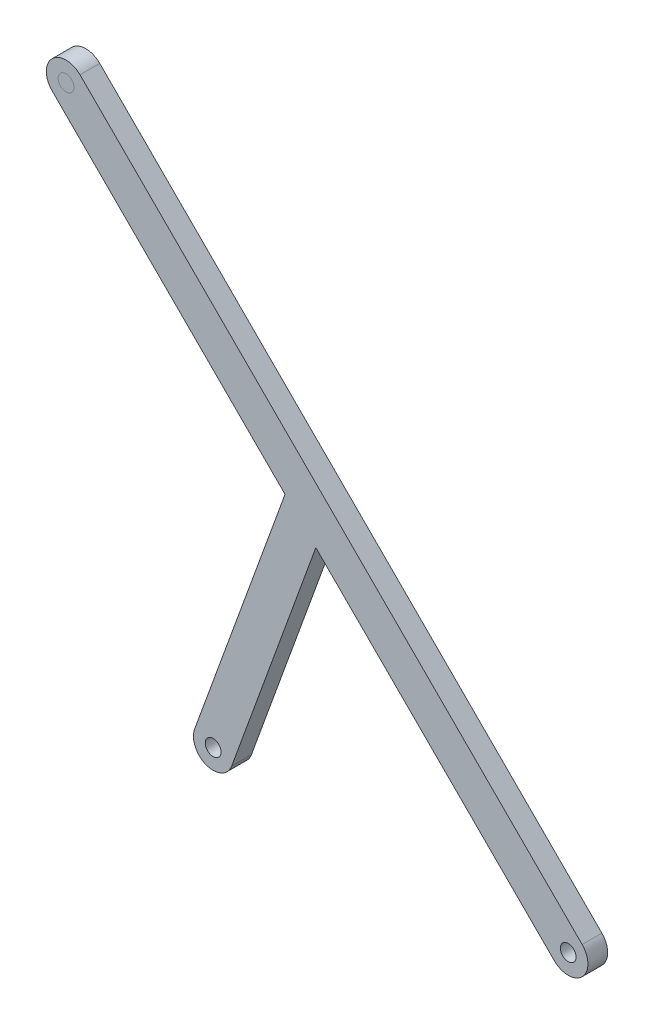
ISO-10303-21;
HEADER;
FILE_DESCRIPTION(('STEP AP214'),'2;1');
FILE_NAME('part.step','',(''),(''),'','','');
FILE_SCHEMA(('AUTOMOTIVE_DESIGN { 1 0 10303 214 1 1 1 1 }'));
ENDSEC;
DATA;
#1=APPLICATION_CONTEXT('core data for automotive mechanical design processes');
#2=APPLICATION_PROTOCOL_DEFINITION('international standard','automotive_design',2000,#1);
#3=PRODUCT_CONTEXT('',#1,'mechanical');
#4=PRODUCT('Part','Part','',(#3));
#5=PRODUCT_RELATED_PRODUCT_CATEGORY('part','',(#4));
#6=PRODUCT_DEFINITION_FORMATION('','',#4);
#7=PRODUCT_DEFINITION_CONTEXT('part definition',#1,'design');
#8=PRODUCT_DEFINITION('design','',#6,#7);
#9=PRODUCT_DEFINITION_SHAPE('','',#8);
#10=(LENGTH_UNIT() NAMED_UNIT(*) SI_UNIT(.MILLI.,.METRE.));
#11=(NAMED_UNIT(*) PLANE_ANGLE_UNIT() SI_UNIT($,.RADIAN.));
#12=(NAMED_UNIT(*) SI_UNIT($,.STERADIAN.) SOLID_ANGLE_UNIT());
#13=UNCERTAINTY_MEASURE_WITH_UNIT(LENGTH_MEASURE(1.E-05),#10,'distance_accuracy_value','');
#14=(GEOMETRIC_REPRESENTATION_CONTEXT(3) GLOBAL_UNCERTAINTY_ASSIGNED_CONTEXT((#13)) GLOBAL_UNIT_ASSIGNED_CONTEXT((#10,
#11,#12)) REPRESENTATION_CONTEXT('',''));
#15=CARTESIAN_POINT('',(0.,0.,0.));
#16=DIRECTION('',(0.,0.,1.));
#17=DIRECTION('',(1.,0.,0.));
#18=AXIS2_PLACEMENT_3D('',#15,#16,#17);
#19=CARTESIAN_POINT('',(0.,0.,10.));
#20=DIRECTION('',(0.,0.,1.));
#21=DIRECTION('',(1.,0.,0.));
#22=AXIS2_PLACEMENT_3D('',#19,#20,#21);
#23=PLANE('',#22);
#24=CARTESIAN_POINT('',(0.,0.,10.));
#25=DIRECTION('',(0.,0.,1.));
#26=DIRECTION('',(1.,0.,0.));
#27=AXIS2_PLACEMENT_3D('',#24,#25,#26);
#28=CIRCLE('',#27,10.);
#29=CARTESIAN_POINT('',(-7.07106781186557,-7.07106781186557,10.));
#30=VERTEX_POINT('',#29);
#31=CARTESIAN_POINT('',(7.07106781186539,7.07106781186538,10.));
#32=VERTEX_POINT('',#31);
#33=EDGE_CURVE('E153',#30,#32,#28,.T.);
#34=ORIENTED_EDGE('',*,*,#33,.T.);
#35=DIRECTION('',(-0.707106781186547,0.707106781186548,0.));
#36=VECTOR('',#35,1.);
#37=CARTESIAN_POINT('',(7.07106781186539,7.07106781186538,10.));
#38=LINE('',#37,#36);
#39=CARTESIAN_POINT('',(-247.487373415291,261.629509039023,10.));
#40=VERTEX_POINT('',#39);
#41=EDGE_CURVE('E101',#32,#40,#38,.T.);
#42=ORIENTED_EDGE('',*,*,#41,.T.);
#43=CARTESIAN_POINT('',(-254.558441227157,254.558441227157,10.));
#44=DIRECTION('',(0.,0.,1.));
#45=DIRECTION('',(1.,0.,0.));
#46=AXIS2_PLACEMENT_3D('',#43,#44,#45);
#47=CIRCLE('',#46,9.99999999999998);
#48=CARTESIAN_POINT('',(-261.629509039023,247.487373415292,10.));
#49=VERTEX_POINT('',#48);
#50=EDGE_CURVE('E184',#40,#49,#47,.T.);
#51=ORIENTED_EDGE('',*,*,#50,.T.);
#52=DIRECTION('',(0.707106781186547,-0.707106781186548,0.));
#53=VECTOR('',#52,1.);
#54=CARTESIAN_POINT('',(-143.543524060909,129.401388437177,10.));
#55=LINE('',#54,#53);
#56=CARTESIAN_POINT('',(-143.543524060909,129.401388437177,10.));
#57=VERTEX_POINT('',#56);
#58=EDGE_CURVE('E183',#49,#57,#55,.T.);
#59=ORIENTED_EDGE('',*,*,#58,.T.);
#60=DIRECTION('',(-0.342020143325664,-0.93969262078591,0.));
#61=VECTOR('',#60,1.);
#62=CARTESIAN_POINT('',(-143.543524060909,129.401388437177,10.));
#63=LINE('',#62,#61);
#64=CARTESIAN_POINT('',(-189.396926207859,3.42020143325663,10.));
#65=VERTEX_POINT('',#64);
#66=EDGE_CURVE('E120',#57,#65,#63,.T.);
#67=ORIENTED_EDGE('',*,*,#66,.T.);
#68=CARTESIAN_POINT('',(-180.,0.,10.));
#69=DIRECTION('',(0.,0.,1.));
#70=DIRECTION('',(-1.,0.,0.));
#71=AXIS2_PLACEMENT_3D('',#68,#69,#70);
#72=CIRCLE('',#71,10.);
#73=CARTESIAN_POINT('',(-170.603073792141,-3.42020143325665,10.));
#74=VERTEX_POINT('',#73);
#75=EDGE_CURVE('E114',#65,#74,#72,.T.);
#76=ORIENTED_EDGE('',*,*,#75,.T.);
#77=DIRECTION('',(0.342020143325665,0.93969262078591,0.));
#78=VECTOR('',#77,1.);
#79=CARTESIAN_POINT('',(-127.939403886711,113.79726826298,10.));
#80=LINE('',#79,#78);
#81=CARTESIAN_POINT('',(-127.939403886711,113.79726826298,10.));
#82=VERTEX_POINT('',#81);
#83=EDGE_CURVE('E118',#74,#82,#80,.T.);
#84=ORIENTED_EDGE('',*,*,#83,.T.);
#85=DIRECTION('',(0.707106781186547,-0.707106781186548,0.));
#86=VECTOR('',#85,1.);
#87=CARTESIAN_POINT('',(-7.07106781186557,-7.07106781186557,10.));
#88=LINE('',#87,#86);
#89=EDGE_CURVE('E57',#82,#30,#88,.T.);
#90=ORIENTED_EDGE('',*,*,#89,.T.);
#91=EDGE_LOOP('',(#34,#42,#51,#59,#67,#76,#84,#90));
#92=FACE_BOUND('',#91,.T.);
#93=CARTESIAN_POINT('',(0.,0.,10.));
#94=DIRECTION('',(0.,0.,1.));
#95=DIRECTION('',(1.,0.,0.));
#96=AXIS2_PLACEMENT_3D('',#93,#94,#95);
#97=CIRCLE('',#96,4.);
#98=CARTESIAN_POINT('',(3.99999999999999,0.,10.));
#99=VERTEX_POINT('',#98);
#100=EDGE_CURVE('E192',#99,#99,#97,.T.);
#101=ORIENTED_EDGE('',*,*,#100,.F.);
#102=EDGE_LOOP('',(#101));
#103=FACE_BOUND('',#102,.T.);
#104=CARTESIAN_POINT('',(-180.,0.,10.));
#105=DIRECTION('',(0.,0.,1.));
#106=DIRECTION('',(1.,0.,0.));
#107=AXIS2_PLACEMENT_3D('',#104,#105,#106);
#108=CIRCLE('',#107,3.99999999999992);
#109=CARTESIAN_POINT('',(-176.,0.,10.));
#110=VERTEX_POINT('',#109);
#111=EDGE_CURVE('E198',#110,#110,#108,.T.);
#112=ORIENTED_EDGE('',*,*,#111,.F.);
#113=EDGE_LOOP('',(#112));
#114=FACE_BOUND('',#113,.T.);
#115=CARTESIAN_POINT('',(-254.558441227157,254.558441227157,10.));
#116=DIRECTION('',(0.,0.,1.));
#117=DIRECTION('',(1.,0.,0.));
#118=AXIS2_PLACEMENT_3D('',#115,#116,#117);
#119=CIRCLE('',#118,3.99999999999999);
#120=CARTESIAN_POINT('',(-250.558441227157,254.558441227157,10.));
#121=VERTEX_POINT('',#120);
#122=EDGE_CURVE('E11',#121,#121,#119,.F.);
#123=ORIENTED_EDGE('',*,*,#122,.T.);
#124=EDGE_LOOP('',(#123));
#125=FACE_BOUND('',#124,.T.);
#126=ADVANCED_FACE('F39',(#92,#103,#114,#125),#23,.T.);
#127=CARTESIAN_POINT('',(0.,0.,10.));
#128=DIRECTION('',(0.,0.,-1.));
#129=DIRECTION('',(-1.,0.,0.));
#130=AXIS2_PLACEMENT_3D('',#127,#128,#129);
#131=CYLINDRICAL_SURFACE('',#130,10.);
#132=CARTESIAN_POINT('',(0.,0.,0.));
#133=DIRECTION('',(0.,0.,1.));
#134=DIRECTION('',(1.,0.,0.));
#135=AXIS2_PLACEMENT_3D('',#132,#133,#134);
#136=CIRCLE('',#135,10.);
#137=CARTESIAN_POINT('',(-7.07106781186557,-7.07106781186557,0.));
#138=VERTEX_POINT('',#137);
#139=CARTESIAN_POINT('',(7.07106781186539,7.07106781186538,0.));
#140=VERTEX_POINT('',#139);
#141=EDGE_CURVE('E138',#138,#140,#136,.T.);
#142=ORIENTED_EDGE('',*,*,#141,.T.);
#143=DIRECTION('',(0.,0.,-1.));
#144=VECTOR('',#143,1.);
#145=CARTESIAN_POINT('',(7.07106781186539,7.07106781186538,10.));
#146=LINE('',#145,#144);
#147=EDGE_CURVE('E49',#32,#140,#146,.T.);
#148=ORIENTED_EDGE('',*,*,#147,.F.);
#149=ORIENTED_EDGE('',*,*,#33,.F.);
#150=DIRECTION('',(0.,0.,-1.));
#151=VECTOR('',#150,1.);
#152=CARTESIAN_POINT('',(-7.07106781186557,-7.07106781186557,10.));
#153=LINE('',#152,#151);
#154=EDGE_CURVE('E134',#30,#138,#153,.T.);
#155=ORIENTED_EDGE('',*,*,#154,.T.);
#156=EDGE_LOOP('',(#142,#148,#149,#155));
#157=FACE_BOUND('',#156,.T.);
#158=ADVANCED_FACE('F41',(#157),#131,.T.);
#159=CARTESIAN_POINT('',(7.07106781186539,7.07106781186538,10.));
#160=DIRECTION('',(-0.707106781186548,-0.707106781186547,0.));
#161=DIRECTION('',(0.707106781186547,-0.707106781186548,0.));
#162=AXIS2_PLACEMENT_3D('',#159,#160,#161);
#163=PLANE('',#162);
#164=DIRECTION('',(-0.707106781186547,0.707106781186548,0.));
#165=VECTOR('',#164,1.);
#166=CARTESIAN_POINT('',(7.07106781186539,7.07106781186538,0.));
#167=LINE('',#166,#165);
#168=CARTESIAN_POINT('',(-247.487373415291,261.629509039023,0.));
#169=VERTEX_POINT('',#168);
#170=EDGE_CURVE('E141',#140,#169,#167,.T.);
#171=ORIENTED_EDGE('',*,*,#170,.T.);
#172=DIRECTION('',(0.,0.,-1.));
#173=VECTOR('',#172,1.);
#174=CARTESIAN_POINT('',(-247.487373415291,261.629509039023,10.));
#175=LINE('',#174,#173);
#176=EDGE_CURVE('E163',#40,#169,#175,.T.);
#177=ORIENTED_EDGE('',*,*,#176,.F.);
#178=ORIENTED_EDGE('',*,*,#41,.F.);
#179=ORIENTED_EDGE('',*,*,#147,.T.);
#180=EDGE_LOOP('',(#171,#177,#178,#179));
#181=FACE_BOUND('',#180,.T.);
#182=ADVANCED_FACE('F166',(#181),#163,.F.);
#183=CARTESIAN_POINT('',(-254.558441227157,254.558441227157,10.));
#184=DIRECTION('',(0.,0.,-1.));
#185=DIRECTION('',(-1.,0.,0.));
#186=AXIS2_PLACEMENT_3D('',#183,#184,#185);
#187=CYLINDRICAL_SURFACE('',#186,9.99999999999998);
#188=CARTESIAN_POINT('',(-254.558441227157,254.558441227157,0.));
#189=DIRECTION('',(0.,0.,1.));
#190=DIRECTION('',(1.,0.,0.));
#191=AXIS2_PLACEMENT_3D('',#188,#189,#190);
#192=CIRCLE('',#191,9.99999999999998);
#193=CARTESIAN_POINT('',(-261.629509039023,247.487373415292,0.));
#194=VERTEX_POINT('',#193);
#195=EDGE_CURVE('E144',#169,#194,#192,.T.);
#196=ORIENTED_EDGE('',*,*,#195,.T.);
#197=DIRECTION('',(0.,0.,-1.));
#198=VECTOR('',#197,1.);
#199=CARTESIAN_POINT('',(-261.629509039023,247.487373415292,10.));
#200=LINE('',#199,#198);
#201=EDGE_CURVE('E160',#49,#194,#200,.T.);
#202=ORIENTED_EDGE('',*,*,#201,.F.);
#203=ORIENTED_EDGE('',*,*,#50,.F.);
#204=ORIENTED_EDGE('',*,*,#176,.T.);
#205=EDGE_LOOP('',(#196,#202,#203,#204));
#206=FACE_BOUND('',#205,.T.);
#207=ADVANCED_FACE('F177',(#206),#187,.T.);
#208=CARTESIAN_POINT('',(-143.543524060909,129.401388437177,10.));
#209=DIRECTION('',(0.707106781186548,0.707106781186547,0.));
#210=DIRECTION('',(-0.707106781186547,0.707106781186548,0.));
#211=AXIS2_PLACEMENT_3D('',#208,#209,#210);
#212=PLANE('',#211);
#213=DIRECTION('',(0.707106781186547,-0.707106781186548,0.));
#214=VECTOR('',#213,1.);
#215=CARTESIAN_POINT('',(-143.543524060909,129.401388437177,0.));
#216=LINE('',#215,#214);
#217=CARTESIAN_POINT('',(-143.543524060909,129.401388437177,0.));
#218=VERTEX_POINT('',#217);
#219=EDGE_CURVE('E146',#194,#218,#216,.T.);
#220=ORIENTED_EDGE('',*,*,#219,.T.);
#221=DIRECTION('',(0.,0.,-1.));
#222=VECTOR('',#221,1.);
#223=CARTESIAN_POINT('',(-143.543524060909,129.401388437177,10.));
#224=LINE('',#223,#222);
#225=EDGE_CURVE('E157',#57,#218,#224,.T.);
#226=ORIENTED_EDGE('',*,*,#225,.F.);
#227=ORIENTED_EDGE('',*,*,#58,.F.);
#228=ORIENTED_EDGE('',*,*,#201,.T.);
#229=EDGE_LOOP('',(#220,#226,#227,#228));
#230=FACE_BOUND('',#229,.T.);
#231=ADVANCED_FACE('F181',(#230),#212,.F.);
#232=CARTESIAN_POINT('',(-143.543524060909,129.401388437177,10.));
#233=DIRECTION('',(0.93969262078591,-0.342020143325664,0.));
#234=DIRECTION('',(0.342020143325664,0.93969262078591,0.));
#235=AXIS2_PLACEMENT_3D('',#232,#233,#234);
#236=PLANE('',#235);
#237=DIRECTION('',(-0.342020143325664,-0.93969262078591,0.));
#238=VECTOR('',#237,1.);
#239=CARTESIAN_POINT('',(-143.543524060909,129.401388437177,0.));
#240=LINE('',#239,#238);
#241=CARTESIAN_POINT('',(-189.396926207859,3.42020143325663,0.));
#242=VERTEX_POINT('',#241);
#243=EDGE_CURVE('E148',#218,#242,#240,.T.);
#244=ORIENTED_EDGE('',*,*,#243,.T.);
#245=DIRECTION('',(0.,0.,-1.));
#246=VECTOR('',#245,1.);
#247=CARTESIAN_POINT('',(-189.396926207859,3.42020143325663,10.));
#248=LINE('',#247,#246);
#249=EDGE_CURVE('E129',#65,#242,#248,.T.);
#250=ORIENTED_EDGE('',*,*,#249,.F.);
#251=ORIENTED_EDGE('',*,*,#66,.F.);
#252=ORIENTED_EDGE('',*,*,#225,.T.);
#253=EDGE_LOOP('',(#244,#250,#251,#252));
#254=FACE_BOUND('',#253,.T.);
#255=ADVANCED_FACE('F227',(#254),#236,.F.);
#256=CARTESIAN_POINT('',(-180.,0.,10.));
#257=DIRECTION('',(0.,0.,-1.));
#258=DIRECTION('',(-1.,0.,0.));
#259=AXIS2_PLACEMENT_3D('',#256,#257,#258);
#260=CYLINDRICAL_SURFACE('',#259,10.);
#261=CARTESIAN_POINT('',(-180.,0.,0.));
#262=DIRECTION('',(0.,0.,1.));
#263=DIRECTION('',(-1.,0.,0.));
#264=AXIS2_PLACEMENT_3D('',#261,#262,#263);
#265=CIRCLE('',#264,10.);
#266=CARTESIAN_POINT('',(-170.603073792141,-3.42020143325665,0.));
#267=VERTEX_POINT('',#266);
#268=EDGE_CURVE('E128',#242,#267,#265,.T.);
#269=ORIENTED_EDGE('',*,*,#268,.T.);
#270=DIRECTION('',(0.,0.,-1.));
#271=VECTOR('',#270,1.);
#272=CARTESIAN_POINT('',(-170.603073792141,-3.42020143325665,10.));
#273=LINE('',#272,#271);
#274=EDGE_CURVE('E125',#74,#267,#273,.T.);
#275=ORIENTED_EDGE('',*,*,#274,.F.);
#276=ORIENTED_EDGE('',*,*,#75,.F.);
#277=ORIENTED_EDGE('',*,*,#249,.T.);
#278=EDGE_LOOP('',(#269,#275,#276,#277));
#279=FACE_BOUND('',#278,.T.);
#280=ADVANCED_FACE('F126',(#279),#260,.T.);
#281=CARTESIAN_POINT('',(-127.939403886711,113.79726826298,10.));
#282=DIRECTION('',(-0.93969262078591,0.342020143325665,0.));
#283=DIRECTION('',(-0.342020143325665,-0.93969262078591,0.));
#284=AXIS2_PLACEMENT_3D('',#281,#282,#283);
#285=PLANE('',#284);
#286=DIRECTION('',(0.342020143325665,0.93969262078591,0.));
#287=VECTOR('',#286,1.);
#288=CARTESIAN_POINT('',(-127.939403886711,113.79726826298,0.));
#289=LINE('',#288,#287);
#290=CARTESIAN_POINT('',(-127.939403886711,113.79726826298,0.));
#291=VERTEX_POINT('',#290);
#292=EDGE_CURVE('E86',#267,#291,#289,.T.);
#293=ORIENTED_EDGE('',*,*,#292,.T.);
#294=DIRECTION('',(0.,0.,-1.));
#295=VECTOR('',#294,1.);
#296=CARTESIAN_POINT('',(-127.939403886711,113.79726826298,10.));
#297=LINE('',#296,#295);
#298=EDGE_CURVE('E130',#82,#291,#297,.T.);
#299=ORIENTED_EDGE('',*,*,#298,.F.);
#300=ORIENTED_EDGE('',*,*,#83,.F.);
#301=ORIENTED_EDGE('',*,*,#274,.T.);
#302=EDGE_LOOP('',(#293,#299,#300,#301));
#303=FACE_BOUND('',#302,.T.);
#304=ADVANCED_FACE('F132',(#303),#285,.F.);
#305=CARTESIAN_POINT('',(-7.07106781186557,-7.07106781186557,10.));
#306=DIRECTION('',(0.707106781186548,0.707106781186547,0.));
#307=DIRECTION('',(-0.707106781186547,0.707106781186548,0.));
#308=AXIS2_PLACEMENT_3D('',#305,#306,#307);
#309=PLANE('',#308);
#310=DIRECTION('',(0.707106781186547,-0.707106781186548,0.));
#311=VECTOR('',#310,1.);
#312=CARTESIAN_POINT('',(-7.07106781186557,-7.07106781186557,0.));
#313=LINE('',#312,#311);
#314=EDGE_CURVE('E92',#291,#138,#313,.T.);
#315=ORIENTED_EDGE('',*,*,#314,.T.);
#316=ORIENTED_EDGE('',*,*,#154,.F.);
#317=ORIENTED_EDGE('',*,*,#89,.F.);
#318=ORIENTED_EDGE('',*,*,#298,.T.);
#319=EDGE_LOOP('',(#315,#316,#317,#318));
#320=FACE_BOUND('',#319,.T.);
#321=ADVANCED_FACE('F211',(#320),#309,.F.);
#322=ORIENTED_EDGE('',*,*,#122,.F.);
#323=EDGE_LOOP('',(#322));
#324=FACE_BOUND('',#323,.T.);
#325=ADVANCED_FACE('F207',(#324),#23,.T.);
#326=CARTESIAN_POINT('',(0.,0.,0.));
#327=DIRECTION('',(0.,0.,1.));
#328=DIRECTION('',(1.,0.,0.));
#329=AXIS2_PLACEMENT_3D('',#326,#327,#328);
#330=PLANE('',#329);
#331=CARTESIAN_POINT('',(-180.,0.,0.));
#332=DIRECTION('',(0.,0.,1.));
#333=DIRECTION('',(1.,0.,0.));
#334=AXIS2_PLACEMENT_3D('',#331,#332,#333);
#335=CIRCLE('',#334,3.99999999999992);
#336=CARTESIAN_POINT('',(-176.,0.,0.));
#337=VERTEX_POINT('',#336);
#338=EDGE_CURVE('E195',#337,#337,#335,.F.);
#339=ORIENTED_EDGE('',*,*,#338,.F.);
#340=EDGE_LOOP('',(#339));
#341=FACE_BOUND('',#340,.T.);
#342=CARTESIAN_POINT('',(0.,0.,0.));
#343=DIRECTION('',(0.,0.,1.));
#344=DIRECTION('',(1.,0.,0.));
#345=AXIS2_PLACEMENT_3D('',#342,#343,#344);
#346=CIRCLE('',#345,4.);
#347=CARTESIAN_POINT('',(3.99999999999999,0.,0.));
#348=VERTEX_POINT('',#347);
#349=EDGE_CURVE('E142',#348,#348,#346,.F.);
#350=ORIENTED_EDGE('',*,*,#349,.F.);
#351=EDGE_LOOP('',(#350));
#352=FACE_BOUND('',#351,.T.);
#353=ORIENTED_EDGE('',*,*,#141,.F.);
#354=ORIENTED_EDGE('',*,*,#314,.F.);
#355=ORIENTED_EDGE('',*,*,#292,.F.);
#356=ORIENTED_EDGE('',*,*,#268,.F.);
#357=ORIENTED_EDGE('',*,*,#243,.F.);
#358=ORIENTED_EDGE('',*,*,#219,.F.);
#359=ORIENTED_EDGE('',*,*,#195,.F.);
#360=ORIENTED_EDGE('',*,*,#170,.F.);
#361=EDGE_LOOP('',(#353,#354,#355,#356,#357,#358,#359,#360));
#362=FACE_BOUND('',#361,.T.);
#363=ADVANCED_FACE('F171',(#341,#352,#362),#330,.F.);
#364=CARTESIAN_POINT('',(0.,0.,-11.3137084989848));
#365=DIRECTION('',(0.,0.,1.));
#366=DIRECTION('',(1.,0.,0.));
#367=AXIS2_PLACEMENT_3D('',#364,#365,#366);
#368=CYLINDRICAL_SURFACE('',#367,4.);
#369=ORIENTED_EDGE('',*,*,#349,.T.);
#370=EDGE_LOOP('',(#369));
#371=FACE_BOUND('',#370,.T.);
#372=ORIENTED_EDGE('',*,*,#100,.T.);
#373=EDGE_LOOP('',(#372));
#374=FACE_BOUND('',#373,.T.);
#375=ADVANCED_FACE('F216',(#371,#374),#368,.F.);
#376=CARTESIAN_POINT('',(-180.,0.,-11.3137084989848));
#377=DIRECTION('',(0.,0.,1.));
#378=DIRECTION('',(1.,0.,0.));
#379=AXIS2_PLACEMENT_3D('',#376,#377,#378);
#380=CYLINDRICAL_SURFACE('',#379,3.99999999999992);
#381=ORIENTED_EDGE('',*,*,#338,.T.);
#382=EDGE_LOOP('',(#381));
#383=FACE_BOUND('',#382,.T.);
#384=ORIENTED_EDGE('',*,*,#111,.T.);
#385=EDGE_LOOP('',(#384));
#386=FACE_BOUND('',#385,.T.);
#387=ADVANCED_FACE('F202',(#383,#386),#380,.F.);
#388=CLOSED_SHELL('',(#126,#158,#182,#207,#231,#255,#280,#304,#321,#325,#363,#375,#387));
#389=MANIFOLD_SOLID_BREP('B2',#388);
#390=ADVANCED_BREP_SHAPE_REPRESENTATION('',(#18,#389),#14);
#391=SHAPE_DEFINITION_REPRESENTATION(#9,#390);
ENDSEC;
END-ISO-10303-21;
